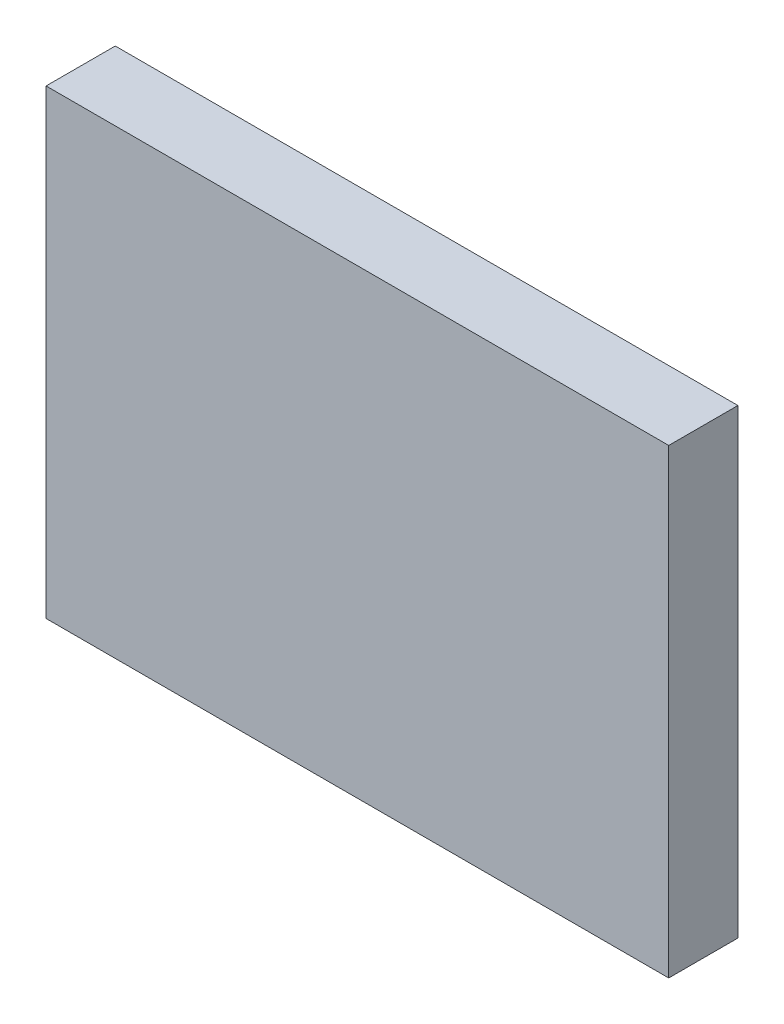
ISO-10303-21;
HEADER;
FILE_DESCRIPTION(('STEP AP214'),'2;1');
FILE_NAME('part.step','',(''),(''),'','','');
FILE_SCHEMA(('AUTOMOTIVE_DESIGN { 1 0 10303 214 1 1 1 1 }'));
ENDSEC;
DATA;
#1=APPLICATION_CONTEXT('core data for automotive mechanical design processes');
#2=APPLICATION_PROTOCOL_DEFINITION('international standard','automotive_design',2000,#1);
#3=PRODUCT_CONTEXT('',#1,'mechanical');
#4=PRODUCT('Part','Part','',(#3));
#5=PRODUCT_RELATED_PRODUCT_CATEGORY('part','',(#4));
#6=PRODUCT_DEFINITION_FORMATION('','',#4);
#7=PRODUCT_DEFINITION_CONTEXT('part definition',#1,'design');
#8=PRODUCT_DEFINITION('design','',#6,#7);
#9=PRODUCT_DEFINITION_SHAPE('','',#8);
#10=(LENGTH_UNIT() NAMED_UNIT(*) SI_UNIT(.MILLI.,.METRE.));
#11=(NAMED_UNIT(*) PLANE_ANGLE_UNIT() SI_UNIT($,.RADIAN.));
#12=(NAMED_UNIT(*) SI_UNIT($,.STERADIAN.) SOLID_ANGLE_UNIT());
#13=UNCERTAINTY_MEASURE_WITH_UNIT(LENGTH_MEASURE(1.E-05),#10,'distance_accuracy_value','');
#14=(GEOMETRIC_REPRESENTATION_CONTEXT(3) GLOBAL_UNCERTAINTY_ASSIGNED_CONTEXT((#13)) GLOBAL_UNIT_ASSIGNED_CONTEXT((#10,
#11,#12)) REPRESENTATION_CONTEXT('',''));
#15=CARTESIAN_POINT('',(0.,0.,0.));
#16=DIRECTION('',(0.,0.,1.));
#17=DIRECTION('',(1.,0.,0.));
#18=AXIS2_PLACEMENT_3D('',#15,#16,#17);
#19=CARTESIAN_POINT('',(-10.8975553852633,5.31446540880503,3.));
#20=DIRECTION('',(1.,0.,0.));
#21=DIRECTION('',(0.,1.,0.));
#22=AXIS2_PLACEMENT_3D('',#19,#20,#21);
#23=PLANE('',#22);
#24=DIRECTION('',(0.,-1.,0.));
#25=VECTOR('',#24,1.);
#26=CARTESIAN_POINT('',(-10.8975553852633,5.31446540880503,0.));
#27=LINE('',#26,#25);
#28=CARTESIAN_POINT('',(-10.8975553852633,5.31446540880503,0.));
#29=VERTEX_POINT('',#28);
#30=CARTESIAN_POINT('',(-10.8975553852633,-14.685534591195,0.));
#31=VERTEX_POINT('',#30);
#32=EDGE_CURVE('E109',#29,#31,#27,.T.);
#33=ORIENTED_EDGE('',*,*,#32,.T.);
#34=DIRECTION('',(0.,0.,-1.));
#35=VECTOR('',#34,1.);
#36=CARTESIAN_POINT('',(-10.8975553852633,-14.685534591195,3.));
#37=LINE('',#36,#35);
#38=CARTESIAN_POINT('',(-10.8975553852633,-14.685534591195,3.));
#39=VERTEX_POINT('',#38);
#40=EDGE_CURVE('E11',#39,#31,#37,.T.);
#41=ORIENTED_EDGE('',*,*,#40,.F.);
#42=DIRECTION('',(0.,-1.,0.));
#43=VECTOR('',#42,1.);
#44=CARTESIAN_POINT('',(-10.8975553852633,5.31446540880503,3.));
#45=LINE('',#44,#43);
#46=CARTESIAN_POINT('',(-10.8975553852633,5.31446540880503,3.));
#47=VERTEX_POINT('',#46);
#48=EDGE_CURVE('E93',#47,#39,#45,.T.);
#49=ORIENTED_EDGE('',*,*,#48,.F.);
#50=DIRECTION('',(0.,0.,-1.));
#51=VECTOR('',#50,1.);
#52=CARTESIAN_POINT('',(-10.8975553852633,5.31446540880503,3.));
#53=LINE('',#52,#51);
#54=EDGE_CURVE('E105',#47,#29,#53,.T.);
#55=ORIENTED_EDGE('',*,*,#54,.T.);
#56=EDGE_LOOP('',(#33,#41,#49,#55));
#57=FACE_BOUND('',#56,.T.);
#58=ADVANCED_FACE('F41',(#57),#23,.F.);
#59=CARTESIAN_POINT('',(-10.8975553852633,-14.685534591195,3.));
#60=DIRECTION('',(0.,1.,0.));
#61=DIRECTION('',(0.,0.,1.));
#62=AXIS2_PLACEMENT_3D('',#59,#60,#61);
#63=PLANE('',#62);
#64=DIRECTION('',(1.,0.,0.));
#65=VECTOR('',#64,1.);
#66=CARTESIAN_POINT('',(-10.8975553852633,-14.685534591195,0.));
#67=LINE('',#66,#65);
#68=CARTESIAN_POINT('',(16.1024446147367,-14.685534591195,0.));
#69=VERTEX_POINT('',#68);
#70=EDGE_CURVE('E98',#31,#69,#67,.T.);
#71=ORIENTED_EDGE('',*,*,#70,.T.);
#72=DIRECTION('',(0.,0.,-1.));
#73=VECTOR('',#72,1.);
#74=CARTESIAN_POINT('',(16.1024446147367,-14.685534591195,3.));
#75=LINE('',#74,#73);
#76=CARTESIAN_POINT('',(16.1024446147367,-14.685534591195,3.));
#77=VERTEX_POINT('',#76);
#78=EDGE_CURVE('E50',#77,#69,#75,.T.);
#79=ORIENTED_EDGE('',*,*,#78,.F.);
#80=DIRECTION('',(1.,0.,0.));
#81=VECTOR('',#80,1.);
#82=CARTESIAN_POINT('',(-10.8975553852633,-14.685534591195,3.));
#83=LINE('',#82,#81);
#84=EDGE_CURVE('E88',#39,#77,#83,.T.);
#85=ORIENTED_EDGE('',*,*,#84,.F.);
#86=ORIENTED_EDGE('',*,*,#40,.T.);
#87=EDGE_LOOP('',(#71,#79,#85,#86));
#88=FACE_BOUND('',#87,.T.);
#89=ADVANCED_FACE('F97',(#88),#63,.F.);
#90=CARTESIAN_POINT('',(16.1024446147367,5.31446540880503,3.));
#91=DIRECTION('',(-1.,0.,0.));
#92=DIRECTION('',(0.,-1.,0.));
#93=AXIS2_PLACEMENT_3D('',#90,#91,#92);
#94=PLANE('',#93);
#95=DIRECTION('',(0.,1.,0.));
#96=VECTOR('',#95,1.);
#97=CARTESIAN_POINT('',(16.1024446147367,5.31446540880503,0.));
#98=LINE('',#97,#96);
#99=CARTESIAN_POINT('',(16.1024446147367,5.31446540880503,0.));
#100=VERTEX_POINT('',#99);
#101=EDGE_CURVE('E75',#69,#100,#98,.T.);
#102=ORIENTED_EDGE('',*,*,#101,.T.);
#103=DIRECTION('',(0.,0.,-1.));
#104=VECTOR('',#103,1.);
#105=CARTESIAN_POINT('',(16.1024446147367,5.31446540880503,3.));
#106=LINE('',#105,#104);
#107=CARTESIAN_POINT('',(16.1024446147367,5.31446540880503,3.));
#108=VERTEX_POINT('',#107);
#109=EDGE_CURVE('E100',#108,#100,#106,.T.);
#110=ORIENTED_EDGE('',*,*,#109,.F.);
#111=DIRECTION('',(0.,1.,0.));
#112=VECTOR('',#111,1.);
#113=CARTESIAN_POINT('',(16.1024446147367,5.31446540880503,3.));
#114=LINE('',#113,#112);
#115=EDGE_CURVE('E91',#77,#108,#114,.T.);
#116=ORIENTED_EDGE('',*,*,#115,.F.);
#117=ORIENTED_EDGE('',*,*,#78,.T.);
#118=EDGE_LOOP('',(#102,#110,#116,#117));
#119=FACE_BOUND('',#118,.T.);
#120=ADVANCED_FACE('F101',(#119),#94,.F.);
#121=CARTESIAN_POINT('',(-10.8975553852633,5.31446540880503,3.));
#122=DIRECTION('',(0.,-1.,0.));
#123=DIRECTION('',(0.,0.,-1.));
#124=AXIS2_PLACEMENT_3D('',#121,#122,#123);
#125=PLANE('',#124);
#126=DIRECTION('',(-1.,0.,0.));
#127=VECTOR('',#126,1.);
#128=CARTESIAN_POINT('',(-10.8975553852633,5.31446540880503,0.));
#129=LINE('',#128,#127);
#130=EDGE_CURVE('E81',#100,#29,#129,.T.);
#131=ORIENTED_EDGE('',*,*,#130,.T.);
#132=ORIENTED_EDGE('',*,*,#54,.F.);
#133=DIRECTION('',(-1.,0.,0.));
#134=VECTOR('',#133,1.);
#135=CARTESIAN_POINT('',(-10.8975553852633,5.31446540880503,3.));
#136=LINE('',#135,#134);
#137=EDGE_CURVE('E58',#108,#47,#136,.T.);
#138=ORIENTED_EDGE('',*,*,#137,.F.);
#139=ORIENTED_EDGE('',*,*,#109,.T.);
#140=EDGE_LOOP('',(#131,#132,#138,#139));
#141=FACE_BOUND('',#140,.T.);
#142=ADVANCED_FACE('F122',(#141),#125,.F.);
#143=CARTESIAN_POINT('',(0.,0.,3.));
#144=DIRECTION('',(0.,0.,1.));
#145=DIRECTION('',(1.,0.,0.));
#146=AXIS2_PLACEMENT_3D('',#143,#144,#145);
#147=PLANE('',#146);
#148=ORIENTED_EDGE('',*,*,#48,.T.);
#149=ORIENTED_EDGE('',*,*,#84,.T.);
#150=ORIENTED_EDGE('',*,*,#115,.T.);
#151=ORIENTED_EDGE('',*,*,#137,.T.);
#152=EDGE_LOOP('',(#148,#149,#150,#151));
#153=FACE_BOUND('',#152,.T.);
#154=ADVANCED_FACE('F89',(#153),#147,.T.);
#155=CARTESIAN_POINT('',(0.,0.,0.));
#156=DIRECTION('',(0.,0.,1.));
#157=DIRECTION('',(1.,0.,0.));
#158=AXIS2_PLACEMENT_3D('',#155,#156,#157);
#159=PLANE('',#158);
#160=ORIENTED_EDGE('',*,*,#32,.F.);
#161=ORIENTED_EDGE('',*,*,#130,.F.);
#162=ORIENTED_EDGE('',*,*,#101,.F.);
#163=ORIENTED_EDGE('',*,*,#70,.F.);
#164=EDGE_LOOP('',(#160,#161,#162,#163));
#165=FACE_BOUND('',#164,.T.);
#166=ADVANCED_FACE('F125',(#165),#159,.F.);
#167=CLOSED_SHELL('',(#58,#89,#120,#142,#154,#166));
#168=MANIFOLD_SOLID_BREP('B2',#167);
#169=ADVANCED_BREP_SHAPE_REPRESENTATION('',(#18,#168),#14);
#170=SHAPE_DEFINITION_REPRESENTATION(#9,#169);
ENDSEC;
END-ISO-10303-21;
